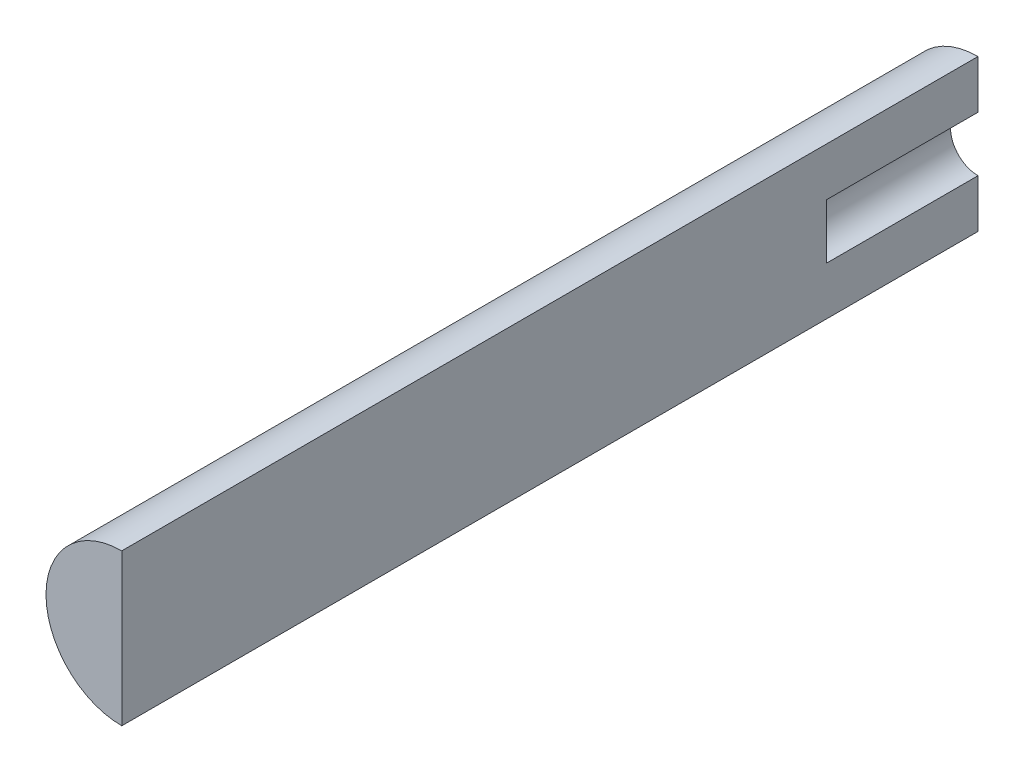
ISO-10303-21;
HEADER;
FILE_DESCRIPTION(('STEP AP214'),'2;1');
FILE_NAME('part.step','',(''),(''),'','','');
FILE_SCHEMA(('AUTOMOTIVE_DESIGN { 1 0 10303 214 1 1 1 1 }'));
ENDSEC;
DATA;
#1=APPLICATION_CONTEXT('core data for automotive mechanical design processes');
#2=APPLICATION_PROTOCOL_DEFINITION('international standard','automotive_design',2000,#1);
#3=PRODUCT_CONTEXT('',#1,'mechanical');
#4=PRODUCT('Part','Part','',(#3));
#5=PRODUCT_RELATED_PRODUCT_CATEGORY('part','',(#4));
#6=PRODUCT_DEFINITION_FORMATION('','',#4);
#7=PRODUCT_DEFINITION_CONTEXT('part definition',#1,'design');
#8=PRODUCT_DEFINITION('design','',#6,#7);
#9=PRODUCT_DEFINITION_SHAPE('','',#8);
#10=(LENGTH_UNIT() NAMED_UNIT(*) SI_UNIT(.MILLI.,.METRE.));
#11=(NAMED_UNIT(*) PLANE_ANGLE_UNIT() SI_UNIT($,.RADIAN.));
#12=(NAMED_UNIT(*) SI_UNIT($,.STERADIAN.) SOLID_ANGLE_UNIT());
#13=UNCERTAINTY_MEASURE_WITH_UNIT(LENGTH_MEASURE(1.E-05),#10,'distance_accuracy_value','');
#14=(GEOMETRIC_REPRESENTATION_CONTEXT(3) GLOBAL_UNCERTAINTY_ASSIGNED_CONTEXT((#13)) GLOBAL_UNIT_ASSIGNED_CONTEXT((#10,
#11,#12)) REPRESENTATION_CONTEXT('',''));
#15=CARTESIAN_POINT('',(0.,0.,0.));
#16=DIRECTION('',(0.,0.,1.));
#17=DIRECTION('',(1.,0.,0.));
#18=AXIS2_PLACEMENT_3D('',#15,#16,#17);
#19=CARTESIAN_POINT('',(0.,0.,45.2));
#20=DIRECTION('',(0.,0.,-1.));
#21=DIRECTION('',(-1.,0.,0.));
#22=AXIS2_PLACEMENT_3D('',#19,#20,#21);
#23=CYLINDRICAL_SURFACE('',#22,4.);
#24=CARTESIAN_POINT('',(0.,0.,45.2));
#25=DIRECTION('',(0.,0.,1.));
#26=DIRECTION('',(1.,0.,0.));
#27=AXIS2_PLACEMENT_3D('',#24,#25,#26);
#28=CIRCLE('',#27,4.);
#29=CARTESIAN_POINT('',(0.,4.,45.2));
#30=VERTEX_POINT('',#29);
#31=CARTESIAN_POINT('',(0.,-4.,45.2));
#32=VERTEX_POINT('',#31);
#33=EDGE_CURVE('E44',#30,#32,#28,.T.);
#34=ORIENTED_EDGE('',*,*,#33,.F.);
#35=DIRECTION('',(0.,0.,-1.));
#36=VECTOR('',#35,1.);
#37=CARTESIAN_POINT('',(0.,4.,60.));
#38=LINE('',#37,#36);
#39=CARTESIAN_POINT('',(0.,4.,0.));
#40=VERTEX_POINT('',#39);
#41=EDGE_CURVE('E81',#30,#40,#38,.T.);
#42=ORIENTED_EDGE('',*,*,#41,.T.);
#43=CARTESIAN_POINT('',(0.,0.,0.));
#44=DIRECTION('',(0.,0.,1.));
#45=DIRECTION('',(1.,0.,0.));
#46=AXIS2_PLACEMENT_3D('',#43,#44,#45);
#47=CIRCLE('',#46,4.);
#48=CARTESIAN_POINT('',(0.,-4.,0.));
#49=VERTEX_POINT('',#48);
#50=EDGE_CURVE('E88',#40,#49,#47,.T.);
#51=ORIENTED_EDGE('',*,*,#50,.T.);
#52=DIRECTION('',(0.,0.,-1.));
#53=VECTOR('',#52,1.);
#54=CARTESIAN_POINT('',(0.,-4.,60.));
#55=LINE('',#54,#53);
#56=EDGE_CURVE('E71',#32,#49,#55,.T.);
#57=ORIENTED_EDGE('',*,*,#56,.F.);
#58=EDGE_LOOP('',(#34,#42,#51,#57));
#59=FACE_BOUND('',#58,.T.);
#60=ADVANCED_FACE('F37',(#59),#23,.T.);
#61=CARTESIAN_POINT('',(0.,0.,45.2));
#62=DIRECTION('',(0.,0.,1.));
#63=DIRECTION('',(1.,0.,0.));
#64=AXIS2_PLACEMENT_3D('',#61,#62,#63);
#65=PLANE('',#64);
#66=DIRECTION('',(0.,-1.,0.));
#67=VECTOR('',#66,1.);
#68=CARTESIAN_POINT('',(0.,0.,45.2));
#69=LINE('',#68,#67);
#70=EDGE_CURVE('E76',#30,#32,#69,.T.);
#71=ORIENTED_EDGE('',*,*,#70,.F.);
#72=ORIENTED_EDGE('',*,*,#33,.T.);
#73=EDGE_LOOP('',(#71,#72));
#74=FACE_BOUND('',#73,.T.);
#75=ADVANCED_FACE('F119',(#74),#65,.T.);
#76=CARTESIAN_POINT('',(0.,0.,0.));
#77=DIRECTION('',(0.,0.,1.));
#78=DIRECTION('',(1.,0.,0.));
#79=AXIS2_PLACEMENT_3D('',#76,#77,#78);
#80=PLANE('',#79);
#81=ORIENTED_EDGE('',*,*,#50,.F.);
#82=DIRECTION('',(0.,1.,0.));
#83=VECTOR('',#82,1.);
#84=CARTESIAN_POINT('',(0.,-4.,0.));
#85=LINE('',#84,#83);
#86=CARTESIAN_POINT('',(0.,1.45,0.));
#87=VERTEX_POINT('',#86);
#88=EDGE_CURVE('E91',#87,#40,#85,.T.);
#89=ORIENTED_EDGE('',*,*,#88,.F.);
#90=CARTESIAN_POINT('',(0.,0.,0.));
#91=DIRECTION('',(0.,0.,-1.));
#92=DIRECTION('',(-1.,0.,0.));
#93=AXIS2_PLACEMENT_3D('',#90,#91,#92);
#94=CIRCLE('',#93,1.45);
#95=CARTESIAN_POINT('',(0.,-1.45,0.));
#96=VERTEX_POINT('',#95);
#97=EDGE_CURVE('E90',#96,#87,#94,.T.);
#98=ORIENTED_EDGE('',*,*,#97,.F.);
#99=EDGE_CURVE('E74',#49,#96,#85,.T.);
#100=ORIENTED_EDGE('',*,*,#99,.F.);
#101=EDGE_LOOP('',(#81,#89,#98,#100));
#102=FACE_BOUND('',#101,.T.);
#103=ADVANCED_FACE('F86',(#102),#80,.F.);
#104=CARTESIAN_POINT('',(0.,0.,8.));
#105=DIRECTION('',(0.,0.,-1.));
#106=DIRECTION('',(-1.,0.,0.));
#107=AXIS2_PLACEMENT_3D('',#104,#105,#106);
#108=CYLINDRICAL_SURFACE('',#107,1.45);
#109=ORIENTED_EDGE('',*,*,#97,.T.);
#110=DIRECTION('',(0.,0.,-1.));
#111=VECTOR('',#110,1.);
#112=CARTESIAN_POINT('',(0.,1.45,8.));
#113=LINE('',#112,#111);
#114=CARTESIAN_POINT('',(0.,1.45,8.));
#115=VERTEX_POINT('',#114);
#116=EDGE_CURVE('E101',#87,#115,#113,.F.);
#117=ORIENTED_EDGE('',*,*,#116,.T.);
#118=CARTESIAN_POINT('',(0.,0.,8.));
#119=DIRECTION('',(0.,0.,-1.));
#120=DIRECTION('',(-1.,0.,0.));
#121=AXIS2_PLACEMENT_3D('',#118,#119,#120);
#122=CIRCLE('',#121,1.45);
#123=CARTESIAN_POINT('',(0.,-1.45,8.));
#124=VERTEX_POINT('',#123);
#125=EDGE_CURVE('E94',#124,#115,#122,.T.);
#126=ORIENTED_EDGE('',*,*,#125,.F.);
#127=DIRECTION('',(0.,0.,-1.));
#128=VECTOR('',#127,1.);
#129=CARTESIAN_POINT('',(0.,-1.45,8.));
#130=LINE('',#129,#128);
#131=EDGE_CURVE('E50',#124,#96,#130,.T.);
#132=ORIENTED_EDGE('',*,*,#131,.T.);
#133=EDGE_LOOP('',(#109,#117,#126,#132));
#134=FACE_BOUND('',#133,.T.);
#135=ADVANCED_FACE('F106',(#134),#108,.F.);
#136=CARTESIAN_POINT('',(0.,0.,8.));
#137=DIRECTION('',(0.,0.,-1.));
#138=DIRECTION('',(-1.,0.,0.));
#139=AXIS2_PLACEMENT_3D('',#136,#137,#138);
#140=PLANE('',#139);
#141=DIRECTION('',(0.,1.,0.));
#142=VECTOR('',#141,1.);
#143=CARTESIAN_POINT('',(0.,0.,8.));
#144=LINE('',#143,#142);
#145=EDGE_CURVE('E11',#124,#115,#144,.T.);
#146=ORIENTED_EDGE('',*,*,#145,.F.);
#147=ORIENTED_EDGE('',*,*,#125,.T.);
#148=EDGE_LOOP('',(#146,#147));
#149=FACE_BOUND('',#148,.T.);
#150=ADVANCED_FACE('F108',(#149),#140,.T.);
#151=CARTESIAN_POINT('',(0.,-4.,60.));
#152=DIRECTION('',(-1.,0.,0.));
#153=DIRECTION('',(0.,0.,1.));
#154=AXIS2_PLACEMENT_3D('',#151,#152,#153);
#155=PLANE('',#154);
#156=ORIENTED_EDGE('',*,*,#70,.T.);
#157=ORIENTED_EDGE('',*,*,#56,.T.);
#158=ORIENTED_EDGE('',*,*,#99,.T.);
#159=ORIENTED_EDGE('',*,*,#131,.F.);
#160=ORIENTED_EDGE('',*,*,#145,.T.);
#161=ORIENTED_EDGE('',*,*,#116,.F.);
#162=ORIENTED_EDGE('',*,*,#88,.T.);
#163=ORIENTED_EDGE('',*,*,#41,.F.);
#164=EDGE_LOOP('',(#156,#157,#158,#159,#160,#161,#162,#163));
#165=FACE_BOUND('',#164,.T.);
#166=ADVANCED_FACE('F73',(#165),#155,.F.);
#167=CLOSED_SHELL('',(#60,#75,#103,#135,#150,#166));
#168=MANIFOLD_SOLID_BREP('B2',#167);
#169=ADVANCED_BREP_SHAPE_REPRESENTATION('',(#18,#168),#14);
#170=SHAPE_DEFINITION_REPRESENTATION(#9,#169);
ENDSEC;
END-ISO-10303-21;
